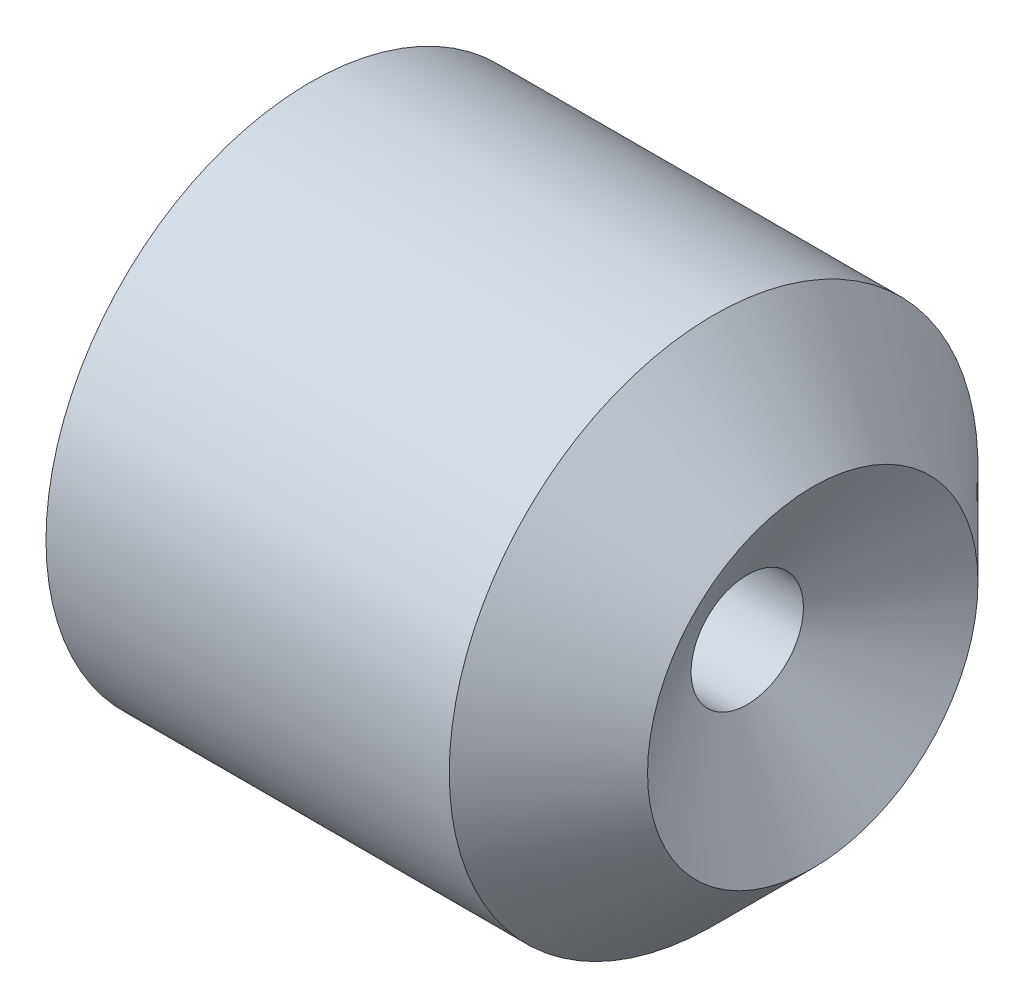
ISO-10303-21;
HEADER;
FILE_DESCRIPTION(('STEP AP214'),'2;1');
FILE_NAME('part.step','',(''),(''),'','','');
FILE_SCHEMA(('AUTOMOTIVE_DESIGN { 1 0 10303 214 1 1 1 1 }'));
ENDSEC;
DATA;
#1=APPLICATION_CONTEXT('core data for automotive mechanical design processes');
#2=APPLICATION_PROTOCOL_DEFINITION('international standard','automotive_design',2000,#1);
#3=PRODUCT_CONTEXT('',#1,'mechanical');
#4=PRODUCT('Part','Part','',(#3));
#5=PRODUCT_RELATED_PRODUCT_CATEGORY('part','',(#4));
#6=PRODUCT_DEFINITION_FORMATION('','',#4);
#7=PRODUCT_DEFINITION_CONTEXT('part definition',#1,'design');
#8=PRODUCT_DEFINITION('design','',#6,#7);
#9=PRODUCT_DEFINITION_SHAPE('','',#8);
#10=(LENGTH_UNIT() NAMED_UNIT(*) SI_UNIT(.MILLI.,.METRE.));
#11=(NAMED_UNIT(*) PLANE_ANGLE_UNIT() SI_UNIT($,.RADIAN.));
#12=(NAMED_UNIT(*) SI_UNIT($,.STERADIAN.) SOLID_ANGLE_UNIT());
#13=UNCERTAINTY_MEASURE_WITH_UNIT(LENGTH_MEASURE(1.E-05),#10,'distance_accuracy_value','');
#14=(GEOMETRIC_REPRESENTATION_CONTEXT(3) GLOBAL_UNCERTAINTY_ASSIGNED_CONTEXT((#13)) GLOBAL_UNIT_ASSIGNED_CONTEXT((#10,
#11,#12)) REPRESENTATION_CONTEXT('',''));
#15=CARTESIAN_POINT('',(0.,0.,0.));
#16=DIRECTION('',(0.,0.,1.));
#17=DIRECTION('',(1.,0.,0.));
#18=AXIS2_PLACEMENT_3D('',#15,#16,#17);
#19=CARTESIAN_POINT('',(0.,0.,0.));
#20=DIRECTION('',(-1.,0.,0.));
#21=DIRECTION('',(0.,0.,1.));
#22=AXIS2_PLACEMENT_3D('',#19,#20,#21);
#23=PLANE('',#22);
#24=CARTESIAN_POINT('',(0.,0.,0.));
#25=DIRECTION('',(-1.,0.,0.));
#26=DIRECTION('',(0.,0.,1.));
#27=AXIS2_PLACEMENT_3D('',#24,#25,#26);
#28=CIRCLE('',#27,3.3095);
#29=CARTESIAN_POINT('',(0.,0.,3.3095));
#30=VERTEX_POINT('',#29);
#31=EDGE_CURVE('E11',#30,#30,#28,.T.);
#32=ORIENTED_EDGE('',*,*,#31,.T.);
#33=EDGE_LOOP('',(#32));
#34=FACE_BOUND('',#33,.T.);
#35=DIRECTION('',(0.,0.,-1.));
#36=VECTOR('',#35,1.);
#37=CARTESIAN_POINT('',(0.,2.,1.15470053837925));
#38=LINE('',#37,#36);
#39=CARTESIAN_POINT('',(0.,2.,1.15470053837925));
#40=VERTEX_POINT('',#39);
#41=CARTESIAN_POINT('',(0.,2.,-1.15470053837925));
#42=VERTEX_POINT('',#41);
#43=EDGE_CURVE('E137',#40,#42,#38,.T.);
#44=ORIENTED_EDGE('',*,*,#43,.F.);
#45=DIRECTION('',(0.,-0.866025403784439,0.5));
#46=VECTOR('',#45,1.);
#47=CARTESIAN_POINT('',(0.,2.,1.15470053837925));
#48=LINE('',#47,#46);
#49=CARTESIAN_POINT('',(0.,0.,2.3094010767585));
#50=VERTEX_POINT('',#49);
#51=EDGE_CURVE('E58',#40,#50,#48,.T.);
#52=ORIENTED_EDGE('',*,*,#51,.T.);
#53=DIRECTION('',(0.,0.866025403784439,0.5));
#54=VECTOR('',#53,1.);
#55=CARTESIAN_POINT('',(0.,-2.,1.15470053837925));
#56=LINE('',#55,#54);
#57=CARTESIAN_POINT('',(0.,-2.,1.15470053837925));
#58=VERTEX_POINT('',#57);
#59=EDGE_CURVE('E127',#58,#50,#56,.T.);
#60=ORIENTED_EDGE('',*,*,#59,.F.);
#61=DIRECTION('',(0.,0.,-1.));
#62=VECTOR('',#61,1.);
#63=CARTESIAN_POINT('',(0.,-2.,1.15470053837925));
#64=LINE('',#63,#62);
#65=CARTESIAN_POINT('',(0.,-2.,-1.15470053837925));
#66=VERTEX_POINT('',#65);
#67=EDGE_CURVE('E131',#58,#66,#64,.T.);
#68=ORIENTED_EDGE('',*,*,#67,.T.);
#69=DIRECTION('',(0.,0.866025403784439,-0.5));
#70=VECTOR('',#69,1.);
#71=CARTESIAN_POINT('',(0.,-2.,-1.15470053837925));
#72=LINE('',#71,#70);
#73=CARTESIAN_POINT('',(0.,0.,-2.30940107675851));
#74=VERTEX_POINT('',#73);
#75=EDGE_CURVE('E134',#66,#74,#72,.T.);
#76=ORIENTED_EDGE('',*,*,#75,.T.);
#77=DIRECTION('',(0.,-0.866025403784439,-0.5));
#78=VECTOR('',#77,1.);
#79=CARTESIAN_POINT('',(0.,2.,-1.15470053837925));
#80=LINE('',#79,#78);
#81=EDGE_CURVE('E116',#42,#74,#80,.T.);
#82=ORIENTED_EDGE('',*,*,#81,.F.);
#83=EDGE_LOOP('',(#44,#52,#60,#68,#76,#82));
#84=FACE_BOUND('',#83,.T.);
#85=ADVANCED_FACE('F43',(#34,#84),#23,.T.);
#86=CARTESIAN_POINT('',(0.,0.,0.));
#87=DIRECTION('',(1.,0.,0.));
#88=DIRECTION('',(0.,0.,-1.));
#89=AXIS2_PLACEMENT_3D('',#86,#87,#88);
#90=CONICAL_SURFACE('',#89,3.3095,1.0471975511966);
#91=CARTESIAN_POINT('',(0.398660360875434,0.,0.));
#92=DIRECTION('',(-1.,0.,0.));
#93=DIRECTION('',(0.,0.,1.));
#94=AXIS2_PLACEMENT_3D('',#91,#92,#93);
#95=CIRCLE('',#94,4.);
#96=CARTESIAN_POINT('',(0.398660360875434,0.,4.));
#97=VERTEX_POINT('',#96);
#98=EDGE_CURVE('E51',#97,#97,#95,.T.);
#99=ORIENTED_EDGE('',*,*,#98,.T.);
#100=EDGE_LOOP('',(#99));
#101=FACE_BOUND('',#100,.T.);
#102=ORIENTED_EDGE('',*,*,#31,.F.);
#103=EDGE_LOOP('',(#102));
#104=FACE_BOUND('',#103,.T.);
#105=ADVANCED_FACE('F155',(#101,#104),#90,.T.);
#106=CARTESIAN_POINT('',(-12.7,0.,0.));
#107=DIRECTION('',(-1.,0.,0.));
#108=DIRECTION('',(0.,0.,1.));
#109=AXIS2_PLACEMENT_3D('',#106,#107,#108);
#110=CYLINDRICAL_SURFACE('',#109,4.);
#111=CARTESIAN_POINT('',(6.50000000000002,0.,0.));
#112=DIRECTION('',(-1.,0.,0.));
#113=DIRECTION('',(0.,0.,1.));
#114=AXIS2_PLACEMENT_3D('',#111,#112,#113);
#115=CIRCLE('',#114,4.);
#116=CARTESIAN_POINT('',(6.50000000000002,0.,4.));
#117=VERTEX_POINT('',#116);
#118=EDGE_CURVE('E149',#117,#117,#115,.T.);
#119=ORIENTED_EDGE('',*,*,#118,.T.);
#120=EDGE_LOOP('',(#119));
#121=FACE_BOUND('',#120,.T.);
#122=ORIENTED_EDGE('',*,*,#98,.F.);
#123=EDGE_LOOP('',(#122));
#124=FACE_BOUND('',#123,.T.);
#125=ADVANCED_FACE('F158',(#121,#124),#110,.T.);
#126=CARTESIAN_POINT('',(6.50000000000002,0.,0.));
#127=DIRECTION('',(-1.,0.,0.));
#128=DIRECTION('',(0.,0.,1.));
#129=AXIS2_PLACEMENT_3D('',#126,#127,#128);
#130=CONICAL_SURFACE('',#129,4.,0.785398163397453);
#131=CARTESIAN_POINT('',(8.,0.,0.));
#132=DIRECTION('',(-1.,0.,0.));
#133=DIRECTION('',(0.,0.,1.));
#134=AXIS2_PLACEMENT_3D('',#131,#132,#133);
#135=CIRCLE('',#134,2.5);
#136=CARTESIAN_POINT('',(8.,0.,2.5));
#137=VERTEX_POINT('',#136);
#138=EDGE_CURVE('E146',#137,#137,#135,.T.);
#139=ORIENTED_EDGE('',*,*,#138,.T.);
#140=EDGE_LOOP('',(#139));
#141=FACE_BOUND('',#140,.T.);
#142=ORIENTED_EDGE('',*,*,#118,.F.);
#143=EDGE_LOOP('',(#142));
#144=FACE_BOUND('',#143,.T.);
#145=ADVANCED_FACE('F160',(#141,#144),#130,.T.);
#146=CARTESIAN_POINT('',(6.49784845243111,0.,0.));
#147=DIRECTION('',(1.,0.,0.));
#148=DIRECTION('',(0.,0.,-1.));
#149=AXIS2_PLACEMENT_3D('',#146,#147,#148);
#150=CONICAL_SURFACE('',#149,0.,1.02974425867666);
#151=CARTESIAN_POINT('',(7.00857997860453,0.,0.));
#152=DIRECTION('',(1.,0.,0.));
#153=DIRECTION('',(0.,0.,-1.));
#154=AXIS2_PLACEMENT_3D('',#151,#152,#153);
#155=CIRCLE('',#154,0.85);
#156=CARTESIAN_POINT('',(7.00857997860453,0.,-0.85));
#157=VERTEX_POINT('',#156);
#158=EDGE_CURVE('E128',#157,#157,#155,.F.);
#159=ORIENTED_EDGE('',*,*,#158,.T.);
#160=EDGE_LOOP('',(#159));
#161=FACE_BOUND('',#160,.T.);
#162=ORIENTED_EDGE('',*,*,#138,.F.);
#163=EDGE_LOOP('',(#162));
#164=FACE_BOUND('',#163,.T.);
#165=ADVANCED_FACE('F167',(#161,#164),#150,.F.);
#166=CARTESIAN_POINT('',(4.,2.,1.15470053837925));
#167=DIRECTION('',(0.,-0.5,-0.866025403784439));
#168=DIRECTION('',(0.,0.866025403784439,-0.5));
#169=AXIS2_PLACEMENT_3D('',#166,#167,#168);
#170=PLANE('',#169);
#171=ORIENTED_EDGE('',*,*,#51,.F.);
#172=DIRECTION('',(-1.,0.,0.));
#173=VECTOR('',#172,1.);
#174=CARTESIAN_POINT('',(4.,2.,1.15470053837925));
#175=LINE('',#174,#173);
#176=CARTESIAN_POINT('',(4.,2.,1.15470053837925));
#177=VERTEX_POINT('',#176);
#178=EDGE_CURVE('E63',#177,#40,#175,.T.);
#179=ORIENTED_EDGE('',*,*,#178,.F.);
#180=DIRECTION('',(0.,-0.866025403784439,0.5));
#181=VECTOR('',#180,1.);
#182=CARTESIAN_POINT('',(4.,2.,1.15470053837925));
#183=LINE('',#182,#181);
#184=CARTESIAN_POINT('',(4.,0.,2.3094010767585));
#185=VERTEX_POINT('',#184);
#186=EDGE_CURVE('E90',#177,#185,#183,.T.);
#187=ORIENTED_EDGE('',*,*,#186,.T.);
#188=DIRECTION('',(-1.,0.,0.));
#189=VECTOR('',#188,1.);
#190=CARTESIAN_POINT('',(4.,0.,2.3094010767585));
#191=LINE('',#190,#189);
#192=EDGE_CURVE('E144',#185,#50,#191,.T.);
#193=ORIENTED_EDGE('',*,*,#192,.T.);
#194=EDGE_LOOP('',(#171,#179,#187,#193));
#195=FACE_BOUND('',#194,.T.);
#196=ADVANCED_FACE('F204',(#195),#170,.T.);
#197=CARTESIAN_POINT('',(4.,-2.,1.15470053837925));
#198=DIRECTION('',(0.,-0.5,0.866025403784439));
#199=DIRECTION('',(0.,-0.866025403784439,-0.5));
#200=AXIS2_PLACEMENT_3D('',#197,#198,#199);
#201=PLANE('',#200);
#202=ORIENTED_EDGE('',*,*,#59,.T.);
#203=ORIENTED_EDGE('',*,*,#192,.F.);
#204=DIRECTION('',(0.,0.866025403784439,0.5));
#205=VECTOR('',#204,1.);
#206=CARTESIAN_POINT('',(4.,-2.,1.15470053837925));
#207=LINE('',#206,#205);
#208=CARTESIAN_POINT('',(4.,-2.,1.15470053837925));
#209=VERTEX_POINT('',#208);
#210=EDGE_CURVE('E221',#209,#185,#207,.T.);
#211=ORIENTED_EDGE('',*,*,#210,.F.);
#212=DIRECTION('',(-1.,0.,0.));
#213=VECTOR('',#212,1.);
#214=CARTESIAN_POINT('',(4.,-2.,1.15470053837925));
#215=LINE('',#214,#213);
#216=EDGE_CURVE('E142',#209,#58,#215,.T.);
#217=ORIENTED_EDGE('',*,*,#216,.T.);
#218=EDGE_LOOP('',(#202,#203,#211,#217));
#219=FACE_BOUND('',#218,.T.);
#220=ADVANCED_FACE('F200',(#219),#201,.F.);
#221=CARTESIAN_POINT('',(4.,-2.,1.15470053837925));
#222=DIRECTION('',(0.,1.,0.));
#223=DIRECTION('',(0.,0.,1.));
#224=AXIS2_PLACEMENT_3D('',#221,#222,#223);
#225=PLANE('',#224);
#226=ORIENTED_EDGE('',*,*,#67,.F.);
#227=ORIENTED_EDGE('',*,*,#216,.F.);
#228=DIRECTION('',(0.,0.,-1.));
#229=VECTOR('',#228,1.);
#230=CARTESIAN_POINT('',(4.,-2.,1.15470053837925));
#231=LINE('',#230,#229);
#232=CARTESIAN_POINT('',(4.,-2.,-1.15470053837925));
#233=VERTEX_POINT('',#232);
#234=EDGE_CURVE('E111',#209,#233,#231,.T.);
#235=ORIENTED_EDGE('',*,*,#234,.T.);
#236=DIRECTION('',(-1.,0.,0.));
#237=VECTOR('',#236,1.);
#238=CARTESIAN_POINT('',(4.,-2.,-1.15470053837925));
#239=LINE('',#238,#237);
#240=EDGE_CURVE('E106',#233,#66,#239,.T.);
#241=ORIENTED_EDGE('',*,*,#240,.T.);
#242=EDGE_LOOP('',(#226,#227,#235,#241));
#243=FACE_BOUND('',#242,.T.);
#244=ADVANCED_FACE('F197',(#243),#225,.T.);
#245=CARTESIAN_POINT('',(4.,-2.,-1.15470053837925));
#246=DIRECTION('',(0.,0.5,0.866025403784439));
#247=DIRECTION('',(0.,-0.866025403784439,0.5));
#248=AXIS2_PLACEMENT_3D('',#245,#246,#247);
#249=PLANE('',#248);
#250=ORIENTED_EDGE('',*,*,#75,.F.);
#251=ORIENTED_EDGE('',*,*,#240,.F.);
#252=DIRECTION('',(0.,0.866025403784439,-0.5));
#253=VECTOR('',#252,1.);
#254=CARTESIAN_POINT('',(4.,-2.,-1.15470053837925));
#255=LINE('',#254,#253);
#256=CARTESIAN_POINT('',(4.,0.,-2.30940107675851));
#257=VERTEX_POINT('',#256);
#258=EDGE_CURVE('E101',#233,#257,#255,.T.);
#259=ORIENTED_EDGE('',*,*,#258,.T.);
#260=DIRECTION('',(-1.,0.,0.));
#261=VECTOR('',#260,1.);
#262=CARTESIAN_POINT('',(4.,0.,-2.30940107675851));
#263=LINE('',#262,#261);
#264=EDGE_CURVE('E105',#257,#74,#263,.T.);
#265=ORIENTED_EDGE('',*,*,#264,.T.);
#266=EDGE_LOOP('',(#250,#251,#259,#265));
#267=FACE_BOUND('',#266,.T.);
#268=ADVANCED_FACE('F104',(#267),#249,.T.);
#269=CARTESIAN_POINT('',(4.,2.,-1.15470053837925));
#270=DIRECTION('',(0.,0.5,-0.866025403784439));
#271=DIRECTION('',(0.,0.866025403784439,0.5));
#272=AXIS2_PLACEMENT_3D('',#269,#270,#271);
#273=PLANE('',#272);
#274=ORIENTED_EDGE('',*,*,#81,.T.);
#275=ORIENTED_EDGE('',*,*,#264,.F.);
#276=DIRECTION('',(0.,-0.866025403784439,-0.5));
#277=VECTOR('',#276,1.);
#278=CARTESIAN_POINT('',(4.,2.,-1.15470053837925));
#279=LINE('',#278,#277);
#280=CARTESIAN_POINT('',(4.,2.,-1.15470053837925));
#281=VERTEX_POINT('',#280);
#282=EDGE_CURVE('E110',#281,#257,#279,.T.);
#283=ORIENTED_EDGE('',*,*,#282,.F.);
#284=DIRECTION('',(-1.,0.,0.));
#285=VECTOR('',#284,1.);
#286=CARTESIAN_POINT('',(4.,2.,-1.15470053837925));
#287=LINE('',#286,#285);
#288=EDGE_CURVE('E86',#281,#42,#287,.T.);
#289=ORIENTED_EDGE('',*,*,#288,.T.);
#290=EDGE_LOOP('',(#274,#275,#283,#289));
#291=FACE_BOUND('',#290,.T.);
#292=ADVANCED_FACE('F113',(#291),#273,.F.);
#293=CARTESIAN_POINT('',(4.,2.,1.15470053837925));
#294=DIRECTION('',(0.,1.,0.));
#295=DIRECTION('',(0.,0.,1.));
#296=AXIS2_PLACEMENT_3D('',#293,#294,#295);
#297=PLANE('',#296);
#298=ORIENTED_EDGE('',*,*,#43,.T.);
#299=ORIENTED_EDGE('',*,*,#288,.F.);
#300=DIRECTION('',(0.,0.,-1.));
#301=VECTOR('',#300,1.);
#302=CARTESIAN_POINT('',(4.,2.,1.15470053837925));
#303=LINE('',#302,#301);
#304=EDGE_CURVE('E121',#177,#281,#303,.T.);
#305=ORIENTED_EDGE('',*,*,#304,.F.);
#306=ORIENTED_EDGE('',*,*,#178,.T.);
#307=EDGE_LOOP('',(#298,#299,#305,#306));
#308=FACE_BOUND('',#307,.T.);
#309=ADVANCED_FACE('F181',(#308),#297,.F.);
#310=CARTESIAN_POINT('',(4.,-2.,3.46410161513775));
#311=DIRECTION('',(1.,0.,0.));
#312=DIRECTION('',(0.,0.,-1.));
#313=AXIS2_PLACEMENT_3D('',#310,#311,#312);
#314=PLANE('',#313);
#315=CARTESIAN_POINT('',(4.,0.,0.));
#316=DIRECTION('',(1.,0.,0.));
#317=DIRECTION('',(0.,0.,-1.));
#318=AXIS2_PLACEMENT_3D('',#315,#316,#317);
#319=CIRCLE('',#318,0.85);
#320=CARTESIAN_POINT('',(4.,0.,-0.85));
#321=VERTEX_POINT('',#320);
#322=EDGE_CURVE('E46',#321,#321,#319,.T.);
#323=ORIENTED_EDGE('',*,*,#322,.T.);
#324=EDGE_LOOP('',(#323));
#325=FACE_BOUND('',#324,.T.);
#326=ORIENTED_EDGE('',*,*,#186,.F.);
#327=ORIENTED_EDGE('',*,*,#304,.T.);
#328=ORIENTED_EDGE('',*,*,#282,.T.);
#329=ORIENTED_EDGE('',*,*,#258,.F.);
#330=ORIENTED_EDGE('',*,*,#234,.F.);
#331=ORIENTED_EDGE('',*,*,#210,.T.);
#332=EDGE_LOOP('',(#326,#327,#328,#329,#330,#331));
#333=FACE_BOUND('',#332,.T.);
#334=ADVANCED_FACE('F119',(#325,#333),#314,.F.);
#335=CARTESIAN_POINT('',(8.,0.,0.));
#336=DIRECTION('',(-1.,0.,0.));
#337=DIRECTION('',(0.,0.,1.));
#338=AXIS2_PLACEMENT_3D('',#335,#336,#337);
#339=CYLINDRICAL_SURFACE('',#338,0.85);
#340=ORIENTED_EDGE('',*,*,#322,.F.);
#341=EDGE_LOOP('',(#340));
#342=FACE_BOUND('',#341,.T.);
#343=ORIENTED_EDGE('',*,*,#158,.F.);
#344=EDGE_LOOP('',(#343));
#345=FACE_BOUND('',#344,.T.);
#346=ADVANCED_FACE('F189',(#342,#345),#339,.F.);
#347=CLOSED_SHELL('',(#85,#105,#125,#145,#165,#196,#220,#244,#268,#292,#309,#334,#346));
#348=MANIFOLD_SOLID_BREP('B2',#347);
#349=ADVANCED_BREP_SHAPE_REPRESENTATION('',(#18,#348),#14);
#350=SHAPE_DEFINITION_REPRESENTATION(#9,#349);
ENDSEC;
END-ISO-10303-21;
